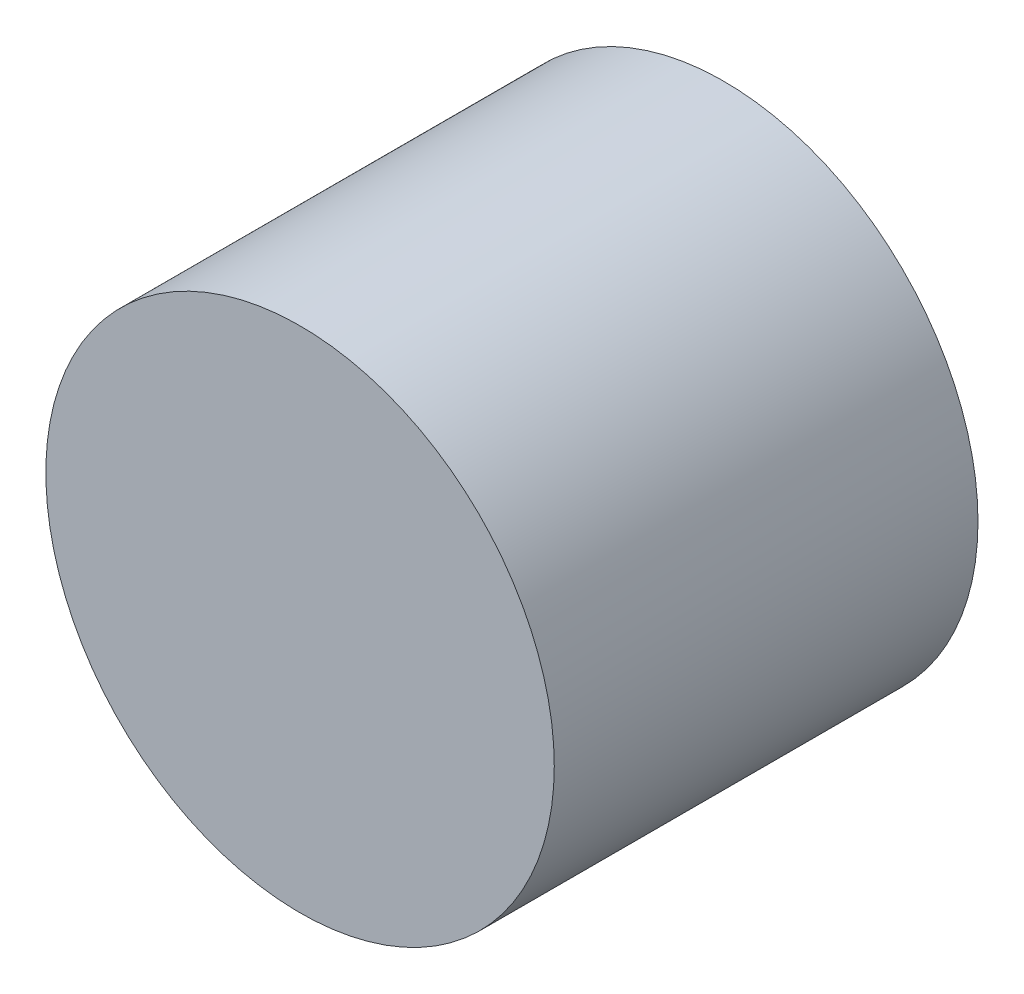
ISO-10303-21;
HEADER;
FILE_DESCRIPTION(('STEP AP214'),'2;1');
FILE_NAME('part.step','',(''),(''),'','','');
FILE_SCHEMA(('AUTOMOTIVE_DESIGN { 1 0 10303 214 1 1 1 1 }'));
ENDSEC;
DATA;
#1=APPLICATION_CONTEXT('core data for automotive mechanical design processes');
#2=APPLICATION_PROTOCOL_DEFINITION('international standard','automotive_design',2000,#1);
#3=PRODUCT_CONTEXT('',#1,'mechanical');
#4=PRODUCT('Part','Part','',(#3));
#5=PRODUCT_RELATED_PRODUCT_CATEGORY('part','',(#4));
#6=PRODUCT_DEFINITION_FORMATION('','',#4);
#7=PRODUCT_DEFINITION_CONTEXT('part definition',#1,'design');
#8=PRODUCT_DEFINITION('design','',#6,#7);
#9=PRODUCT_DEFINITION_SHAPE('','',#8);
#10=(LENGTH_UNIT() NAMED_UNIT(*) SI_UNIT(.MILLI.,.METRE.));
#11=(NAMED_UNIT(*) PLANE_ANGLE_UNIT() SI_UNIT($,.RADIAN.));
#12=(NAMED_UNIT(*) SI_UNIT($,.STERADIAN.) SOLID_ANGLE_UNIT());
#13=UNCERTAINTY_MEASURE_WITH_UNIT(LENGTH_MEASURE(1.E-05),#10,'distance_accuracy_value','');
#14=(GEOMETRIC_REPRESENTATION_CONTEXT(3) GLOBAL_UNCERTAINTY_ASSIGNED_CONTEXT((#13)) GLOBAL_UNIT_ASSIGNED_CONTEXT((#10,
#11,#12)) REPRESENTATION_CONTEXT('',''));
#15=CARTESIAN_POINT('',(0.,0.,0.));
#16=DIRECTION('',(0.,0.,1.));
#17=DIRECTION('',(1.,0.,0.));
#18=AXIS2_PLACEMENT_3D('',#15,#16,#17);
#19=CARTESIAN_POINT('',(0.,0.,10.));
#20=DIRECTION('',(0.,0.,-1.));
#21=DIRECTION('',(-1.,0.,0.));
#22=AXIS2_PLACEMENT_3D('',#19,#20,#21);
#23=CYLINDRICAL_SURFACE('',#22,6.);
#24=CARTESIAN_POINT('',(0.,0.,10.));
#25=DIRECTION('',(0.,0.,1.));
#26=DIRECTION('',(1.,0.,0.));
#27=AXIS2_PLACEMENT_3D('',#24,#25,#26);
#28=CIRCLE('',#27,6.);
#29=CARTESIAN_POINT('',(6.,0.,10.));
#30=VERTEX_POINT('',#29);
#31=EDGE_CURVE('E10',#30,#30,#28,.T.);
#32=ORIENTED_EDGE('',*,*,#31,.F.);
#33=EDGE_LOOP('',(#32));
#34=FACE_BOUND('',#33,.T.);
#35=CARTESIAN_POINT('',(0.,0.,0.));
#36=DIRECTION('',(0.,0.,1.));
#37=DIRECTION('',(1.,0.,0.));
#38=AXIS2_PLACEMENT_3D('',#35,#36,#37);
#39=CIRCLE('',#38,6.);
#40=CARTESIAN_POINT('',(6.,0.,0.));
#41=VERTEX_POINT('',#40);
#42=EDGE_CURVE('E42',#41,#41,#39,.T.);
#43=ORIENTED_EDGE('',*,*,#42,.T.);
#44=EDGE_LOOP('',(#43));
#45=FACE_BOUND('',#44,.T.);
#46=ADVANCED_FACE('F39',(#34,#45),#23,.T.);
#47=CARTESIAN_POINT('',(0.,0.,10.));
#48=DIRECTION('',(0.,0.,1.));
#49=DIRECTION('',(1.,0.,0.));
#50=AXIS2_PLACEMENT_3D('',#47,#48,#49);
#51=PLANE('',#50);
#52=ORIENTED_EDGE('',*,*,#31,.T.);
#53=EDGE_LOOP('',(#52));
#54=FACE_BOUND('',#53,.T.);
#55=ADVANCED_FACE('F54',(#54),#51,.T.);
#56=CARTESIAN_POINT('',(0.,0.,0.));
#57=DIRECTION('',(0.,0.,1.));
#58=DIRECTION('',(1.,0.,0.));
#59=AXIS2_PLACEMENT_3D('',#56,#57,#58);
#60=PLANE('',#59);
#61=ORIENTED_EDGE('',*,*,#42,.F.);
#62=EDGE_LOOP('',(#61));
#63=FACE_BOUND('',#62,.T.);
#64=ADVANCED_FACE('F52',(#63),#60,.F.);
#65=CLOSED_SHELL('',(#46,#55,#64));
#66=MANIFOLD_SOLID_BREP('B2',#65);
#67=ADVANCED_BREP_SHAPE_REPRESENTATION('',(#18,#66),#14);
#68=SHAPE_DEFINITION_REPRESENTATION(#9,#67);
ENDSEC;
END-ISO-10303-21;
